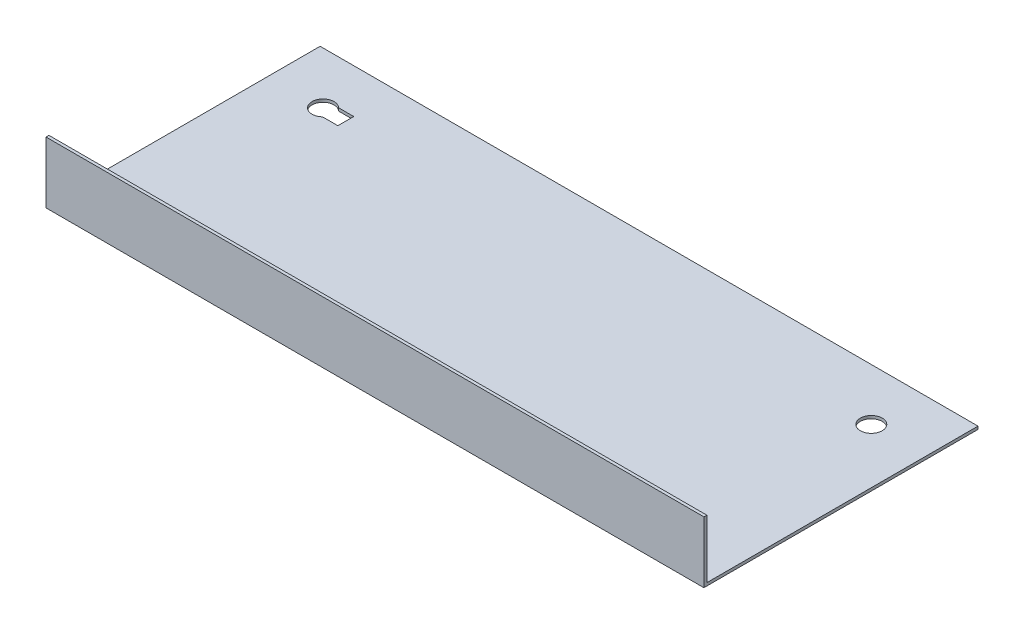
ISO-10303-21;
HEADER;
FILE_DESCRIPTION(('STEP AP214'),'2;1');
FILE_NAME('part.step','',(''),(''),'','','');
FILE_SCHEMA(('AUTOMOTIVE_DESIGN { 1 0 10303 214 1 1 1 1 }'));
ENDSEC;
DATA;
#1=APPLICATION_CONTEXT('core data for automotive mechanical design processes');
#2=APPLICATION_PROTOCOL_DEFINITION('international standard','automotive_design',2000,#1);
#3=PRODUCT_CONTEXT('',#1,'mechanical');
#4=PRODUCT('Part','Part','',(#3));
#5=PRODUCT_RELATED_PRODUCT_CATEGORY('part','',(#4));
#6=PRODUCT_DEFINITION_FORMATION('','',#4);
#7=PRODUCT_DEFINITION_CONTEXT('part definition',#1,'design');
#8=PRODUCT_DEFINITION('design','',#6,#7);
#9=PRODUCT_DEFINITION_SHAPE('','',#8);
#10=(LENGTH_UNIT() NAMED_UNIT(*) SI_UNIT(.MILLI.,.METRE.));
#11=(NAMED_UNIT(*) PLANE_ANGLE_UNIT() SI_UNIT($,.RADIAN.));
#12=(NAMED_UNIT(*) SI_UNIT($,.STERADIAN.) SOLID_ANGLE_UNIT());
#13=UNCERTAINTY_MEASURE_WITH_UNIT(LENGTH_MEASURE(1.E-05),#10,'distance_accuracy_value','');
#14=(GEOMETRIC_REPRESENTATION_CONTEXT(3) GLOBAL_UNCERTAINTY_ASSIGNED_CONTEXT((#13)) GLOBAL_UNIT_ASSIGNED_CONTEXT((#10,
#11,#12)) REPRESENTATION_CONTEXT('',''));
#15=CARTESIAN_POINT('',(0.,0.,0.));
#16=DIRECTION('',(0.,0.,1.));
#17=DIRECTION('',(1.,0.,0.));
#18=AXIS2_PLACEMENT_3D('',#15,#16,#17);
#19=CARTESIAN_POINT('',(0.,4.,0.));
#20=DIRECTION('',(0.,-1.,0.));
#21=DIRECTION('',(0.,0.,-1.));
#22=AXIS2_PLACEMENT_3D('',#19,#20,#21);
#23=PLANE('',#22);
#24=DIRECTION('',(-1.,0.,0.));
#25=VECTOR('',#24,1.);
#26=CARTESIAN_POINT('',(-450.,4.,183.5));
#27=LINE('',#26,#25);
#28=CARTESIAN_POINT('',(450.,4.,183.5));
#29=VERTEX_POINT('',#28);
#30=CARTESIAN_POINT('',(-450.,4.,183.5));
#31=VERTEX_POINT('',#30);
#32=EDGE_CURVE('E56',#29,#31,#27,.T.);
#33=ORIENTED_EDGE('',*,*,#32,.F.);
#34=DIRECTION('',(0.,0.,-1.));
#35=VECTOR('',#34,1.);
#36=CARTESIAN_POINT('',(450.,4.,187.5));
#37=LINE('',#36,#35);
#38=CARTESIAN_POINT('',(450.,4.,-187.5));
#39=VERTEX_POINT('',#38);
#40=EDGE_CURVE('E161',#29,#39,#37,.T.);
#41=ORIENTED_EDGE('',*,*,#40,.T.);
#42=DIRECTION('',(-1.,0.,0.));
#43=VECTOR('',#42,1.);
#44=CARTESIAN_POINT('',(-450.,4.,-187.5));
#45=LINE('',#44,#43);
#46=CARTESIAN_POINT('',(-450.,4.,-187.5));
#47=VERTEX_POINT('',#46);
#48=EDGE_CURVE('E163',#39,#47,#45,.T.);
#49=ORIENTED_EDGE('',*,*,#48,.T.);
#50=DIRECTION('',(0.,0.,1.));
#51=VECTOR('',#50,1.);
#52=CARTESIAN_POINT('',(-450.,4.,187.5));
#53=LINE('',#52,#51);
#54=EDGE_CURVE('E166',#47,#31,#53,.T.);
#55=ORIENTED_EDGE('',*,*,#54,.T.);
#56=EDGE_LOOP('',(#33,#41,#49,#55));
#57=FACE_BOUND('',#56,.T.);
#58=CARTESIAN_POINT('',(375.,4.,-116.5));
#59=DIRECTION('',(0.,1.,0.));
#60=DIRECTION('',(0.,0.,1.));
#61=AXIS2_PLACEMENT_3D('',#58,#59,#60);
#62=CIRCLE('',#61,15.);
#63=CARTESIAN_POINT('',(375.,4.,-101.5));
#64=VERTEX_POINT('',#63);
#65=EDGE_CURVE('E139',#64,#64,#62,.T.);
#66=ORIENTED_EDGE('',*,*,#65,.F.);
#67=EDGE_LOOP('',(#66));
#68=FACE_BOUND('',#67,.T.);
#69=DIRECTION('',(-1.,0.,0.));
#70=VECTOR('',#69,1.);
#71=CARTESIAN_POINT('',(0.,4.,-127.286348112151));
#72=LINE('',#71,#70);
#73=CARTESIAN_POINT('',(-343.747335512518,4.,-127.286348112151));
#74=VERTEX_POINT('',#73);
#75=CARTESIAN_POINT('',(-364.576243747885,4.,-127.286348112151));
#76=VERTEX_POINT('',#75);
#77=EDGE_CURVE('E132',#74,#76,#72,.T.);
#78=ORIENTED_EDGE('',*,*,#77,.F.);
#79=DIRECTION('',(0.,0.,-1.));
#80=VECTOR('',#79,1.);
#81=CARTESIAN_POINT('',(-343.747335512518,4.,0.));
#82=LINE('',#81,#80);
#83=CARTESIAN_POINT('',(-343.747335512518,4.,-105.528943217617));
#84=VERTEX_POINT('',#83);
#85=EDGE_CURVE('E134',#84,#74,#82,.T.);
#86=ORIENTED_EDGE('',*,*,#85,.F.);
#87=DIRECTION('',(1.,0.,0.));
#88=VECTOR('',#87,1.);
#89=CARTESIAN_POINT('',(0.,4.,-105.528943217617));
#90=LINE('',#89,#88);
#91=CARTESIAN_POINT('',(-364.770830284049,4.,-105.528943217617));
#92=VERTEX_POINT('',#91);
#93=EDGE_CURVE('E120',#92,#84,#90,.T.);
#94=ORIENTED_EDGE('',*,*,#93,.F.);
#95=CARTESIAN_POINT('',(-375.,4.,-116.5));
#96=DIRECTION('',(0.,1.,0.));
#97=DIRECTION('',(0.,0.,1.));
#98=AXIS2_PLACEMENT_3D('',#95,#96,#97);
#99=CIRCLE('',#98,15.);
#100=EDGE_CURVE('E136',#76,#92,#99,.T.);
#101=ORIENTED_EDGE('',*,*,#100,.F.);
#102=EDGE_LOOP('',(#78,#86,#94,#101));
#103=FACE_BOUND('',#102,.T.);
#104=ADVANCED_FACE('F33',(#57,#68,#103),#23,.F.);
#105=CARTESIAN_POINT('',(0.,0.,0.));
#106=DIRECTION('',(0.,-1.,0.));
#107=DIRECTION('',(0.,0.,-1.));
#108=AXIS2_PLACEMENT_3D('',#105,#106,#107);
#109=PLANE('',#108);
#110=CARTESIAN_POINT('',(375.,0.,-116.5));
#111=DIRECTION('',(0.,-1.,0.));
#112=DIRECTION('',(0.,0.,-1.));
#113=AXIS2_PLACEMENT_3D('',#110,#111,#112);
#114=CIRCLE('',#113,15.);
#115=CARTESIAN_POINT('',(375.,0.,-131.5));
#116=VERTEX_POINT('',#115);
#117=EDGE_CURVE('E142',#116,#116,#114,.T.);
#118=ORIENTED_EDGE('',*,*,#117,.F.);
#119=EDGE_LOOP('',(#118));
#120=FACE_BOUND('',#119,.T.);
#121=DIRECTION('',(0.,0.,-1.));
#122=VECTOR('',#121,1.);
#123=CARTESIAN_POINT('',(450.,0.,187.5));
#124=LINE('',#123,#122);
#125=CARTESIAN_POINT('',(450.,0.,187.5));
#126=VERTEX_POINT('',#125);
#127=CARTESIAN_POINT('',(450.,0.,-187.5));
#128=VERTEX_POINT('',#127);
#129=EDGE_CURVE('E160',#126,#128,#124,.T.);
#130=ORIENTED_EDGE('',*,*,#129,.F.);
#131=DIRECTION('',(1.,0.,0.));
#132=VECTOR('',#131,1.);
#133=CARTESIAN_POINT('',(-450.,0.,187.5));
#134=LINE('',#133,#132);
#135=CARTESIAN_POINT('',(-450.,0.,187.5));
#136=VERTEX_POINT('',#135);
#137=EDGE_CURVE('E164',#136,#126,#134,.T.);
#138=ORIENTED_EDGE('',*,*,#137,.F.);
#139=DIRECTION('',(0.,0.,1.));
#140=VECTOR('',#139,1.);
#141=CARTESIAN_POINT('',(-450.,0.,187.5));
#142=LINE('',#141,#140);
#143=CARTESIAN_POINT('',(-450.,0.,-187.5));
#144=VERTEX_POINT('',#143);
#145=EDGE_CURVE('E173',#144,#136,#142,.T.);
#146=ORIENTED_EDGE('',*,*,#145,.F.);
#147=DIRECTION('',(-1.,0.,0.));
#148=VECTOR('',#147,1.);
#149=CARTESIAN_POINT('',(-450.,0.,-187.5));
#150=LINE('',#149,#148);
#151=EDGE_CURVE('E171',#128,#144,#150,.T.);
#152=ORIENTED_EDGE('',*,*,#151,.F.);
#153=EDGE_LOOP('',(#130,#138,#146,#152));
#154=FACE_BOUND('',#153,.T.);
#155=DIRECTION('',(0.,0.,-1.));
#156=VECTOR('',#155,1.);
#157=CARTESIAN_POINT('',(-343.747335512519,0.,0.));
#158=LINE('',#157,#156);
#159=CARTESIAN_POINT('',(-343.747335512519,0.,-105.528943217617));
#160=VERTEX_POINT('',#159);
#161=CARTESIAN_POINT('',(-343.747335512519,0.,-127.286348112151));
#162=VERTEX_POINT('',#161);
#163=EDGE_CURVE('E11',#160,#162,#158,.T.);
#164=ORIENTED_EDGE('',*,*,#163,.T.);
#165=DIRECTION('',(-1.,0.,0.));
#166=VECTOR('',#165,1.);
#167=CARTESIAN_POINT('',(0.,0.,-127.286348112151));
#168=LINE('',#167,#166);
#169=CARTESIAN_POINT('',(-364.576243747885,0.,-127.286348112151));
#170=VERTEX_POINT('',#169);
#171=EDGE_CURVE('E127',#162,#170,#168,.T.);
#172=ORIENTED_EDGE('',*,*,#171,.T.);
#173=CARTESIAN_POINT('',(-375.,0.,-116.5));
#174=DIRECTION('',(0.,-1.,0.));
#175=DIRECTION('',(0.,0.,-1.));
#176=AXIS2_PLACEMENT_3D('',#173,#174,#175);
#177=CIRCLE('',#176,15.);
#178=CARTESIAN_POINT('',(-364.770830284049,0.,-105.528943217617));
#179=VERTEX_POINT('',#178);
#180=EDGE_CURVE('E125',#179,#170,#177,.T.);
#181=ORIENTED_EDGE('',*,*,#180,.F.);
#182=DIRECTION('',(1.,0.,0.));
#183=VECTOR('',#182,1.);
#184=CARTESIAN_POINT('',(0.,0.,-105.528943217617));
#185=LINE('',#184,#183);
#186=EDGE_CURVE('E48',#179,#160,#185,.T.);
#187=ORIENTED_EDGE('',*,*,#186,.T.);
#188=EDGE_LOOP('',(#164,#172,#181,#187));
#189=FACE_BOUND('',#188,.T.);
#190=ADVANCED_FACE('F123',(#120,#154,#189),#109,.T.);
#191=CARTESIAN_POINT('',(-375.,-76.,-116.5));
#192=DIRECTION('',(0.,1.,0.));
#193=DIRECTION('',(0.,0.,1.));
#194=AXIS2_PLACEMENT_3D('',#191,#192,#193);
#195=CYLINDRICAL_SURFACE('',#194,15.);
#196=DIRECTION('',(0.,1.,0.));
#197=VECTOR('',#196,1.);
#198=CARTESIAN_POINT('',(-364.576243747885,-76.,-127.286348112151));
#199=LINE('',#198,#197);
#200=EDGE_CURVE('E41',#76,#170,#199,.F.);
#201=ORIENTED_EDGE('',*,*,#200,.F.);
#202=ORIENTED_EDGE('',*,*,#100,.T.);
#203=DIRECTION('',(0.,1.,0.));
#204=VECTOR('',#203,1.);
#205=CARTESIAN_POINT('',(-364.770830284049,-76.,-105.528943217617));
#206=LINE('',#205,#204);
#207=EDGE_CURVE('E187',#179,#92,#206,.T.);
#208=ORIENTED_EDGE('',*,*,#207,.F.);
#209=ORIENTED_EDGE('',*,*,#180,.T.);
#210=EDGE_LOOP('',(#201,#202,#208,#209));
#211=FACE_BOUND('',#210,.T.);
#212=ADVANCED_FACE('F197',(#211),#195,.F.);
#213=CARTESIAN_POINT('',(450.,4.,187.5));
#214=DIRECTION('',(-1.,0.,0.));
#215=DIRECTION('',(0.,0.,1.));
#216=AXIS2_PLACEMENT_3D('',#213,#214,#215);
#217=PLANE('',#216);
#218=ORIENTED_EDGE('',*,*,#129,.T.);
#219=DIRECTION('',(0.,-1.,0.));
#220=VECTOR('',#219,1.);
#221=CARTESIAN_POINT('',(450.,4.,-187.5));
#222=LINE('',#221,#220);
#223=EDGE_CURVE('E184',#39,#128,#222,.T.);
#224=ORIENTED_EDGE('',*,*,#223,.F.);
#225=ORIENTED_EDGE('',*,*,#40,.F.);
#226=DIRECTION('',(0.,-1.,0.));
#227=VECTOR('',#226,1.);
#228=CARTESIAN_POINT('',(450.,84.,183.5));
#229=LINE('',#228,#227);
#230=CARTESIAN_POINT('',(450.,84.,183.5));
#231=VERTEX_POINT('',#230);
#232=EDGE_CURVE('E157',#231,#29,#229,.T.);
#233=ORIENTED_EDGE('',*,*,#232,.F.);
#234=DIRECTION('',(0.,0.,-1.));
#235=VECTOR('',#234,1.);
#236=CARTESIAN_POINT('',(450.,84.,187.5));
#237=LINE('',#236,#235);
#238=CARTESIAN_POINT('',(450.,84.,187.5));
#239=VERTEX_POINT('',#238);
#240=EDGE_CURVE('E149',#239,#231,#237,.T.);
#241=ORIENTED_EDGE('',*,*,#240,.F.);
#242=DIRECTION('',(0.,-1.,0.));
#243=VECTOR('',#242,1.);
#244=CARTESIAN_POINT('',(450.,4.,187.5));
#245=LINE('',#244,#243);
#246=EDGE_CURVE('E168',#239,#126,#245,.T.);
#247=ORIENTED_EDGE('',*,*,#246,.T.);
#248=EDGE_LOOP('',(#218,#224,#225,#233,#241,#247));
#249=FACE_BOUND('',#248,.T.);
#250=ADVANCED_FACE('F35',(#249),#217,.F.);
#251=CARTESIAN_POINT('',(-450.,4.,-187.5));
#252=DIRECTION('',(0.,0.,1.));
#253=DIRECTION('',(1.,0.,0.));
#254=AXIS2_PLACEMENT_3D('',#251,#252,#253);
#255=PLANE('',#254);
#256=ORIENTED_EDGE('',*,*,#151,.T.);
#257=DIRECTION('',(0.,-1.,0.));
#258=VECTOR('',#257,1.);
#259=CARTESIAN_POINT('',(-450.,4.,-187.5));
#260=LINE('',#259,#258);
#261=EDGE_CURVE('E181',#47,#144,#260,.T.);
#262=ORIENTED_EDGE('',*,*,#261,.F.);
#263=ORIENTED_EDGE('',*,*,#48,.F.);
#264=ORIENTED_EDGE('',*,*,#223,.T.);
#265=EDGE_LOOP('',(#256,#262,#263,#264));
#266=FACE_BOUND('',#265,.T.);
#267=ADVANCED_FACE('F217',(#266),#255,.F.);
#268=CARTESIAN_POINT('',(-450.,4.,187.5));
#269=DIRECTION('',(1.,0.,0.));
#270=DIRECTION('',(0.,0.,-1.));
#271=AXIS2_PLACEMENT_3D('',#268,#269,#270);
#272=PLANE('',#271);
#273=ORIENTED_EDGE('',*,*,#145,.T.);
#274=DIRECTION('',(0.,-1.,0.));
#275=VECTOR('',#274,1.);
#276=CARTESIAN_POINT('',(-450.,4.,187.5));
#277=LINE('',#276,#275);
#278=CARTESIAN_POINT('',(-450.,84.,187.5));
#279=VERTEX_POINT('',#278);
#280=EDGE_CURVE('E178',#279,#136,#277,.T.);
#281=ORIENTED_EDGE('',*,*,#280,.F.);
#282=DIRECTION('',(0.,0.,1.));
#283=VECTOR('',#282,1.);
#284=CARTESIAN_POINT('',(-450.,84.,187.5));
#285=LINE('',#284,#283);
#286=CARTESIAN_POINT('',(-450.,84.,183.5));
#287=VERTEX_POINT('',#286);
#288=EDGE_CURVE('E143',#287,#279,#285,.T.);
#289=ORIENTED_EDGE('',*,*,#288,.F.);
#290=DIRECTION('',(0.,-1.,0.));
#291=VECTOR('',#290,1.);
#292=CARTESIAN_POINT('',(-450.,84.,183.5));
#293=LINE('',#292,#291);
#294=EDGE_CURVE('E153',#287,#31,#293,.T.);
#295=ORIENTED_EDGE('',*,*,#294,.T.);
#296=ORIENTED_EDGE('',*,*,#54,.F.);
#297=ORIENTED_EDGE('',*,*,#261,.T.);
#298=EDGE_LOOP('',(#273,#281,#289,#295,#296,#297));
#299=FACE_BOUND('',#298,.T.);
#300=ADVANCED_FACE('F214',(#299),#272,.F.);
#301=CARTESIAN_POINT('',(-450.,4.,187.5));
#302=DIRECTION('',(0.,0.,-1.));
#303=DIRECTION('',(-1.,0.,0.));
#304=AXIS2_PLACEMENT_3D('',#301,#302,#303);
#305=PLANE('',#304);
#306=ORIENTED_EDGE('',*,*,#137,.T.);
#307=ORIENTED_EDGE('',*,*,#246,.F.);
#308=DIRECTION('',(1.,0.,0.));
#309=VECTOR('',#308,1.);
#310=CARTESIAN_POINT('',(-450.,84.,187.5));
#311=LINE('',#310,#309);
#312=EDGE_CURVE('E146',#279,#239,#311,.T.);
#313=ORIENTED_EDGE('',*,*,#312,.F.);
#314=ORIENTED_EDGE('',*,*,#280,.T.);
#315=EDGE_LOOP('',(#306,#307,#313,#314));
#316=FACE_BOUND('',#315,.T.);
#317=ADVANCED_FACE('F211',(#316),#305,.F.);
#318=CARTESIAN_POINT('',(-450.,84.,183.5));
#319=DIRECTION('',(0.,0.,1.));
#320=DIRECTION('',(1.,0.,0.));
#321=AXIS2_PLACEMENT_3D('',#318,#319,#320);
#322=PLANE('',#321);
#323=ORIENTED_EDGE('',*,*,#32,.T.);
#324=ORIENTED_EDGE('',*,*,#294,.F.);
#325=DIRECTION('',(-1.,0.,0.));
#326=VECTOR('',#325,1.);
#327=CARTESIAN_POINT('',(-450.,84.,183.5));
#328=LINE('',#327,#326);
#329=EDGE_CURVE('E151',#231,#287,#328,.T.);
#330=ORIENTED_EDGE('',*,*,#329,.F.);
#331=ORIENTED_EDGE('',*,*,#232,.T.);
#332=EDGE_LOOP('',(#323,#324,#330,#331));
#333=FACE_BOUND('',#332,.T.);
#334=ADVANCED_FACE('F208',(#333),#322,.F.);
#335=CARTESIAN_POINT('',(0.,84.,0.));
#336=DIRECTION('',(0.,-1.,0.));
#337=DIRECTION('',(0.,0.,-1.));
#338=AXIS2_PLACEMENT_3D('',#335,#336,#337);
#339=PLANE('',#338);
#340=ORIENTED_EDGE('',*,*,#288,.T.);
#341=ORIENTED_EDGE('',*,*,#312,.T.);
#342=ORIENTED_EDGE('',*,*,#240,.T.);
#343=ORIENTED_EDGE('',*,*,#329,.T.);
#344=EDGE_LOOP('',(#340,#341,#342,#343));
#345=FACE_BOUND('',#344,.T.);
#346=ADVANCED_FACE('F238',(#345),#339,.F.);
#347=CARTESIAN_POINT('',(375.,-76.,-116.5));
#348=DIRECTION('',(0.,1.,0.));
#349=DIRECTION('',(0.,0.,1.));
#350=AXIS2_PLACEMENT_3D('',#347,#348,#349);
#351=CYLINDRICAL_SURFACE('',#350,15.);
#352=ORIENTED_EDGE('',*,*,#117,.T.);
#353=EDGE_LOOP('',(#352));
#354=FACE_BOUND('',#353,.T.);
#355=ORIENTED_EDGE('',*,*,#65,.T.);
#356=EDGE_LOOP('',(#355));
#357=FACE_BOUND('',#356,.T.);
#358=ADVANCED_FACE('F246',(#354,#357),#351,.F.);
#359=CARTESIAN_POINT('',(-343.747335512519,-17.9999999999976,-127.286348112151));
#360=DIRECTION('',(-1.,0.,0.));
#361=DIRECTION('',(0.,-1.,0.));
#362=AXIS2_PLACEMENT_3D('',#359,#360,#361);
#363=PLANE('',#362);
#364=ORIENTED_EDGE('',*,*,#85,.T.);
#365=DIRECTION('',(0.,1.,0.));
#366=VECTOR('',#365,1.);
#367=CARTESIAN_POINT('',(-343.747335512519,-17.9999999999976,-127.286348112151));
#368=LINE('',#367,#366);
#369=EDGE_CURVE('E115',#162,#74,#368,.T.);
#370=ORIENTED_EDGE('',*,*,#369,.F.);
#371=ORIENTED_EDGE('',*,*,#163,.F.);
#372=DIRECTION('',(0.,1.,0.));
#373=VECTOR('',#372,1.);
#374=CARTESIAN_POINT('',(-343.747335512519,-17.9999999999976,-105.528943217617));
#375=LINE('',#374,#373);
#376=EDGE_CURVE('E112',#160,#84,#375,.T.);
#377=ORIENTED_EDGE('',*,*,#376,.T.);
#378=EDGE_LOOP('',(#364,#370,#371,#377));
#379=FACE_BOUND('',#378,.T.);
#380=ADVANCED_FACE('F111',(#379),#363,.T.);
#381=CARTESIAN_POINT('',(-375.47666210873,-17.9999999999974,-127.286348112151));
#382=DIRECTION('',(0.,0.,1.));
#383=DIRECTION('',(1.,0.,0.));
#384=AXIS2_PLACEMENT_3D('',#381,#382,#383);
#385=PLANE('',#384);
#386=ORIENTED_EDGE('',*,*,#77,.T.);
#387=ORIENTED_EDGE('',*,*,#200,.T.);
#388=ORIENTED_EDGE('',*,*,#171,.F.);
#389=ORIENTED_EDGE('',*,*,#369,.T.);
#390=EDGE_LOOP('',(#386,#387,#388,#389));
#391=FACE_BOUND('',#390,.T.);
#392=ADVANCED_FACE('F193',(#391),#385,.T.);
#393=CARTESIAN_POINT('',(-343.747335512519,-17.9999999999976,-105.528943217617));
#394=DIRECTION('',(0.,0.,-1.));
#395=DIRECTION('',(-1.,0.,0.));
#396=AXIS2_PLACEMENT_3D('',#393,#394,#395);
#397=PLANE('',#396);
#398=ORIENTED_EDGE('',*,*,#93,.T.);
#399=ORIENTED_EDGE('',*,*,#376,.F.);
#400=ORIENTED_EDGE('',*,*,#186,.F.);
#401=ORIENTED_EDGE('',*,*,#207,.T.);
#402=EDGE_LOOP('',(#398,#399,#400,#401));
#403=FACE_BOUND('',#402,.T.);
#404=ADVANCED_FACE('F118',(#403),#397,.T.);
#405=CLOSED_SHELL('',(#104,#190,#212,#250,#267,#300,#317,#334,#346,#358,#380,#392,#404));
#406=MANIFOLD_SOLID_BREP('B2',#405);
#407=ADVANCED_BREP_SHAPE_REPRESENTATION('',(#18,#406),#14);
#408=SHAPE_DEFINITION_REPRESENTATION(#9,#407);
ENDSEC;
END-ISO-10303-21;
